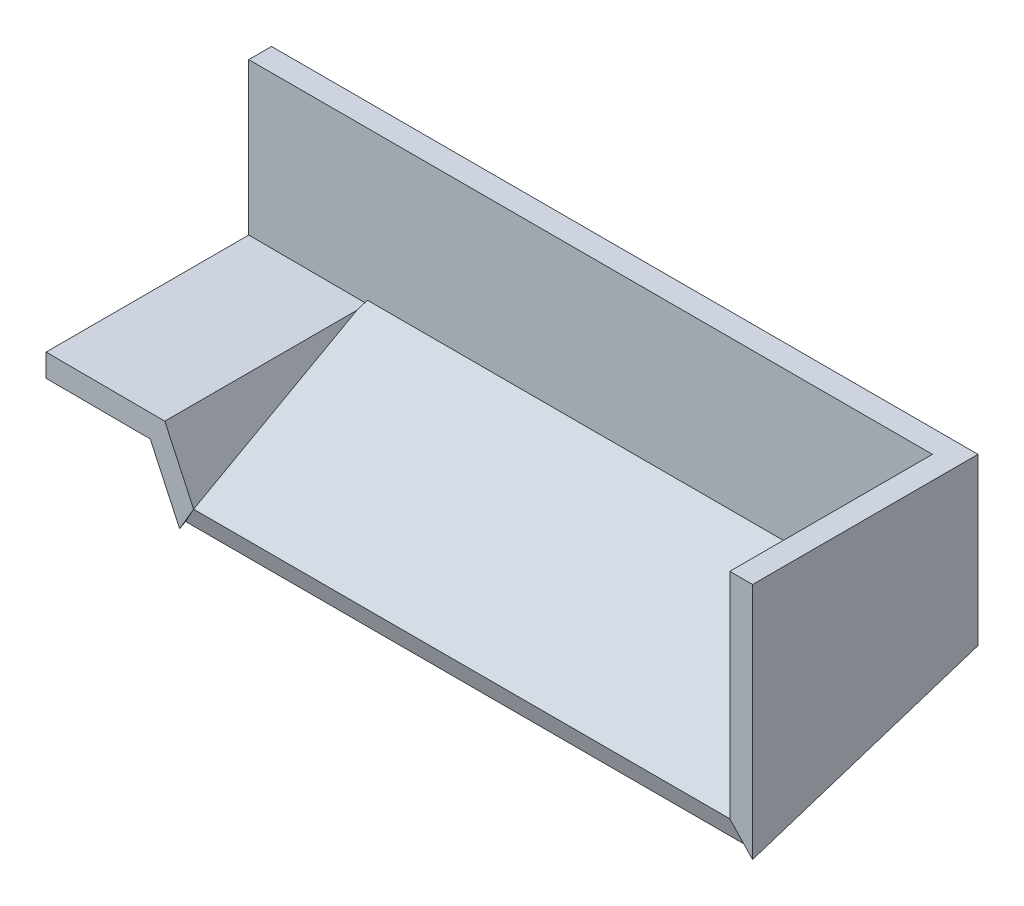
ISO-10303-21;
HEADER;
FILE_DESCRIPTION(('STEP AP214'),'2;1');
FILE_NAME('part.step','',(''),(''),'','','');
FILE_SCHEMA(('AUTOMOTIVE_DESIGN { 1 0 10303 214 1 1 1 1 }'));
ENDSEC;
DATA;
#1=APPLICATION_CONTEXT('core data for automotive mechanical design processes');
#2=APPLICATION_PROTOCOL_DEFINITION('international standard','automotive_design',2000,#1);
#3=PRODUCT_CONTEXT('',#1,'mechanical');
#4=PRODUCT('Part','Part','',(#3));
#5=PRODUCT_RELATED_PRODUCT_CATEGORY('part','',(#4));
#6=PRODUCT_DEFINITION_FORMATION('','',#4);
#7=PRODUCT_DEFINITION_CONTEXT('part definition',#1,'design');
#8=PRODUCT_DEFINITION('design','',#6,#7);
#9=PRODUCT_DEFINITION_SHAPE('','',#8);
#10=(LENGTH_UNIT() NAMED_UNIT(*) SI_UNIT(.MILLI.,.METRE.));
#11=(NAMED_UNIT(*) PLANE_ANGLE_UNIT() SI_UNIT($,.RADIAN.));
#12=(NAMED_UNIT(*) SI_UNIT($,.STERADIAN.) SOLID_ANGLE_UNIT());
#13=UNCERTAINTY_MEASURE_WITH_UNIT(LENGTH_MEASURE(1.E-05),#10,'distance_accuracy_value','');
#14=(GEOMETRIC_REPRESENTATION_CONTEXT(3) GLOBAL_UNCERTAINTY_ASSIGNED_CONTEXT((#13)) GLOBAL_UNIT_ASSIGNED_CONTEXT((#10,
#11,#12)) REPRESENTATION_CONTEXT('',''));
#15=CARTESIAN_POINT('',(0.,0.,0.));
#16=DIRECTION('',(0.,0.,1.));
#17=DIRECTION('',(1.,0.,0.));
#18=AXIS2_PLACEMENT_3D('',#15,#16,#17);
#19=CARTESIAN_POINT('',(65.9999999999999,200.410930223505,-2153.1741858194));
#20=DIRECTION('',(0.707106781186554,0.673097987092456,0.216654332456276));
#21=DIRECTION('',(0.156924969843194,0.149377553908836,-0.976248380397082));
#22=AXIS2_PLACEMENT_3D('',#19,#20,#21);
#23=PLANE('',#22);
#24=DIRECTION('',(0.689474113973616,-0.724310324488266,0.));
#25=VECTOR('',#24,1.);
#26=CARTESIAN_POINT('',(60.,174.043896,-2051.675));
#27=LINE('',#26,#25);
#28=CARTESIAN_POINT('',(60.,174.043896,-2051.675));
#29=VERTEX_POINT('',#28);
#30=CARTESIAN_POINT('',(65.9999999999999,167.740741379904,-2051.675));
#31=VERTEX_POINT('',#30);
#32=EDGE_CURVE('E14',#29,#31,#27,.T.);
#33=ORIENTED_EDGE('',*,*,#32,.F.);
#34=DIRECTION('',(0.707106781186541,-0.673097987092484,-0.216654332456233));
#35=VECTOR('',#34,1.);
#36=CARTESIAN_POINT('',(60.,174.043896,-2051.675));
#37=LINE('',#36,#35);
#38=CARTESIAN_POINT('',(65.9999999999999,168.332470187087,-2053.51337297184));
#39=VERTEX_POINT('',#38);
#40=EDGE_CURVE('E85',#29,#39,#37,.T.);
#41=ORIENTED_EDGE('',*,*,#40,.T.);
#42=DIRECTION('',(0.,-0.306395495306557,0.951904302152191));
#43=VECTOR('',#42,1.);
#44=CARTESIAN_POINT('',(65.9999999999999,200.410930223505,-2153.1741858194));
#45=LINE('',#44,#43);
#46=EDGE_CURVE('E261',#39,#31,#45,.T.);
#47=ORIENTED_EDGE('',*,*,#46,.T.);
#48=EDGE_LOOP('',(#33,#41,#47));
#49=FACE_BOUND('',#48,.T.);
#50=ADVANCED_FACE('F74',(#49),#23,.F.);
#51=CARTESIAN_POINT('',(-88.7498349655472,174.043896,-2051.675));
#52=DIRECTION('',(0.,0.306395495306557,-0.951904302152191));
#53=DIRECTION('',(1.,0.,0.));
#54=AXIS2_PLACEMENT_3D('',#51,#52,#53);
#55=PLANE('',#54);
#56=ORIENTED_EDGE('',*,*,#40,.F.);
#57=DIRECTION('',(1.,0.,0.));
#58=VECTOR('',#57,1.);
#59=CARTESIAN_POINT('',(-88.7498349655472,174.043896,-2051.675));
#60=LINE('',#59,#58);
#61=CARTESIAN_POINT('',(-81.1580015599324,174.043896,-2051.675));
#62=VERTEX_POINT('',#61);
#63=EDGE_CURVE('E207',#62,#29,#60,.T.);
#64=ORIENTED_EDGE('',*,*,#63,.F.);
#65=DIRECTION('',(-0.55055005957005,-0.794651759321001,-0.255779618647485));
#66=VECTOR('',#65,1.);
#67=CARTESIAN_POINT('',(-81.1580015599324,174.043896,-2051.675));
#68=LINE('',#67,#66);
#69=CARTESIAN_POINT('',(-85.1149874781617,168.332470187087,-2053.51337297184));
#70=VERTEX_POINT('',#69);
#71=EDGE_CURVE('E253',#62,#70,#68,.T.);
#72=ORIENTED_EDGE('',*,*,#71,.T.);
#73=DIRECTION('',(-1.,0.,0.));
#74=VECTOR('',#73,1.);
#75=CARTESIAN_POINT('',(-88.7498349655471,168.332470187087,-2053.51337297184));
#76=LINE('',#75,#74);
#77=EDGE_CURVE('E281',#70,#39,#76,.F.);
#78=ORIENTED_EDGE('',*,*,#77,.T.);
#79=EDGE_LOOP('',(#56,#64,#72,#78));
#80=FACE_BOUND('',#79,.T.);
#81=ADVANCED_FACE('F424',(#80),#55,.F.);
#82=CARTESIAN_POINT('',(8.68903530955106,-32.830905852799,-1428.54242522263));
#83=DIRECTION('',(0.828926894883838,-0.484095403635641,-0.280235335240015));
#84=DIRECTION('',(-0.241990858302143,0.141323273438157,-0.959931329253773));
#85=AXIS2_PLACEMENT_3D('',#82,#83,#84);
#86=PLANE('',#85);
#87=ORIENTED_EDGE('',*,*,#71,.F.);
#88=DIRECTION('',(-0.504302119206771,-0.86352728536136,0.));
#89=VECTOR('',#88,1.);
#90=CARTESIAN_POINT('',(-81.1580015599324,174.043896,-2051.675));
#91=LINE('',#90,#89);
#92=CARTESIAN_POINT('',(-84.8390598038214,167.740741379904,-2051.675));
#93=VERTEX_POINT('',#92);
#94=EDGE_CURVE('E248',#62,#93,#91,.T.);
#95=ORIENTED_EDGE('',*,*,#94,.T.);
#96=DIRECTION('',(0.141438259135338,-0.303315325540556,0.942334883226229));
#97=VECTOR('',#96,1.);
#98=CARTESIAN_POINT('',(8.68903530955106,-32.830905852799,-1428.54242522263));
#99=LINE('',#98,#97);
#100=EDGE_CURVE('E267',#70,#93,#99,.T.);
#101=ORIENTED_EDGE('',*,*,#100,.F.);
#102=EDGE_LOOP('',(#87,#95,#101));
#103=FACE_BOUND('',#102,.T.);
#104=ADVANCED_FACE('F428',(#103),#86,.T.);
#105=CARTESIAN_POINT('',(-88.7498349655472,190.324635277696,-2051.675));
#106=DIRECTION('',(0.,0.,-1.));
#107=DIRECTION('',(-0.999990687223878,0.00431572305834902,0.));
#108=AXIS2_PLACEMENT_3D('',#105,#106,#107);
#109=PLANE('',#108);
#110=DIRECTION('',(-0.999990687223878,0.00431572305834902,0.));
#111=VECTOR('',#110,1.);
#112=CARTESIAN_POINT('',(-88.7757293038973,184.324691154353,-2051.675));
#113=LINE('',#112,#111);
#114=CARTESIAN_POINT('',(-92.5799384560384,184.341109220408,-2051.675));
#115=VERTEX_POINT('',#114);
#116=CARTESIAN_POINT('',(-120.025894338734,184.45955946817,-2051.675));
#117=VERTEX_POINT('',#116);
#118=EDGE_CURVE('E289',#115,#117,#113,.T.);
#119=ORIENTED_EDGE('',*,*,#118,.F.);
#120=DIRECTION('',(-0.422618261740701,0.906307787036649,0.));
#121=VECTOR('',#120,1.);
#122=CARTESIAN_POINT('',(-5.4378467222199,-2.5357095704442,-2051.675));
#123=LINE('',#122,#121);
#124=EDGE_CURVE('E285',#93,#115,#123,.T.);
#125=ORIENTED_EDGE('',*,*,#124,.F.);
#126=ORIENTED_EDGE('',*,*,#94,.F.);
#127=DIRECTION('',(-0.422618261740701,0.906307787036649,0.));
#128=VECTOR('',#127,1.);
#129=CARTESIAN_POINT('',(0.,0.,-2051.675));
#130=LINE('',#129,#128);
#131=CARTESIAN_POINT('',(-88.7498349655472,190.324635277696,-2051.675));
#132=VERTEX_POINT('',#131);
#133=EDGE_CURVE('E188',#62,#132,#130,.T.);
#134=ORIENTED_EDGE('',*,*,#133,.T.);
#135=DIRECTION('',(-0.999990687223878,0.00431572305834902,0.));
#136=VECTOR('',#135,1.);
#137=CARTESIAN_POINT('',(-88.7498349655472,190.324635277696,-2051.675));
#138=LINE('',#137,#136);
#139=CARTESIAN_POINT('',(-120.000000000384,190.459503591513,-2051.675));
#140=VERTEX_POINT('',#139);
#141=EDGE_CURVE('E185',#132,#140,#138,.T.);
#142=ORIENTED_EDGE('',*,*,#141,.T.);
#143=DIRECTION('',(-0.00431572305834902,-0.999990687223878,0.));
#144=VECTOR('',#143,1.);
#145=CARTESIAN_POINT('',(-120.000000000384,190.459503591513,-2051.675));
#146=LINE('',#145,#144);
#147=EDGE_CURVE('E239',#140,#117,#146,.T.);
#148=ORIENTED_EDGE('',*,*,#147,.T.);
#149=EDGE_LOOP('',(#119,#125,#126,#134,#142,#148));
#150=FACE_BOUND('',#149,.T.);
#151=ADVANCED_FACE('F395',(#150),#109,.F.);
#152=CARTESIAN_POINT('',(-120.000000000384,190.459503591513,-2105.025));
#153=DIRECTION('',(-0.999990687223878,0.00431572305834902,0.));
#154=DIRECTION('',(0.,0.,1.));
#155=AXIS2_PLACEMENT_3D('',#152,#153,#154);
#156=PLANE('',#155);
#157=ORIENTED_EDGE('',*,*,#147,.F.);
#158=DIRECTION('',(0.,0.,1.));
#159=VECTOR('',#158,1.);
#160=CARTESIAN_POINT('',(-120.000000000384,190.459503591513,-2105.025));
#161=LINE('',#160,#159);
#162=CARTESIAN_POINT('',(-120.000000000384,190.459503591512,-2105.025));
#163=VERTEX_POINT('',#162);
#164=EDGE_CURVE('E197',#163,#140,#161,.T.);
#165=ORIENTED_EDGE('',*,*,#164,.F.);
#166=DIRECTION('',(-0.0030516770402824,-0.707100196059335,-0.707106781186612));
#167=VECTOR('',#166,1.);
#168=CARTESIAN_POINT('',(-120.000000000384,190.459503591512,-2105.025));
#169=LINE('',#168,#167);
#170=CARTESIAN_POINT('',(-120.025894338734,184.45955946817,-2111.025));
#171=VERTEX_POINT('',#170);
#172=EDGE_CURVE('E234',#163,#171,#169,.T.);
#173=ORIENTED_EDGE('',*,*,#172,.T.);
#174=DIRECTION('',(0.,0.,1.));
#175=VECTOR('',#174,1.);
#176=CARTESIAN_POINT('',(-120.025894338734,184.45955946817,-2105.025));
#177=LINE('',#176,#175);
#178=EDGE_CURVE('E294',#171,#117,#177,.T.);
#179=ORIENTED_EDGE('',*,*,#178,.T.);
#180=EDGE_LOOP('',(#157,#165,#173,#179));
#181=FACE_BOUND('',#180,.T.);
#182=ADVANCED_FACE('F393',(#181),#156,.T.);
#183=CARTESIAN_POINT('',(0.793833422292556,183.938130127213,-2111.025));
#184=DIRECTION('',(0.00305167704028202,0.707100196059465,-0.707106781186483));
#185=DIRECTION('',(-0.99999534362278,0.00215785148126406,-0.00215787157703857));
#186=AXIS2_PLACEMENT_3D('',#183,#184,#185);
#187=PLANE('',#186);
#188=ORIENTED_EDGE('',*,*,#172,.F.);
#189=DIRECTION('',(4.52577043816717E-11,-0.707110073757822,-0.707103488599942));
#190=VECTOR('',#189,1.);
#191=CARTESIAN_POINT('',(-120.000000000384,190.459503591512,-2105.025));
#192=LINE('',#191,#190);
#193=CARTESIAN_POINT('',(-120.,184.459447714334,-2111.025));
#194=VERTEX_POINT('',#193);
#195=EDGE_CURVE('E226',#163,#194,#192,.T.);
#196=ORIENTED_EDGE('',*,*,#195,.T.);
#197=DIRECTION('',(0.999990687223878,-0.00431572305834902,0.));
#198=VECTOR('',#197,1.);
#199=CARTESIAN_POINT('',(0.793833422292556,183.938130127213,-2111.025));
#200=LINE('',#199,#198);
#201=EDGE_CURVE('E272',#171,#194,#200,.T.);
#202=ORIENTED_EDGE('',*,*,#201,.F.);
#203=EDGE_LOOP('',(#188,#196,#202));
#204=FACE_BOUND('',#203,.T.);
#205=ADVANCED_FACE('F420',(#204),#187,.T.);
#206=CARTESIAN_POINT('',(-120.,230.45950359151,-2105.025));
#207=DIRECTION('',(1.,0.,0.));
#208=DIRECTION('',(0.,-1.,0.));
#209=AXIS2_PLACEMENT_3D('',#206,#207,#208);
#210=PLANE('',#209);
#211=ORIENTED_EDGE('',*,*,#195,.F.);
#212=DIRECTION('',(0.,-1.,0.));
#213=VECTOR('',#212,1.);
#214=CARTESIAN_POINT('',(-120.,230.45950359151,-2105.025));
#215=LINE('',#214,#213);
#216=CARTESIAN_POINT('',(-120.,230.45950359151,-2105.025));
#217=VERTEX_POINT('',#216);
#218=EDGE_CURVE('E153',#217,#163,#215,.T.);
#219=ORIENTED_EDGE('',*,*,#218,.F.);
#220=DIRECTION('',(0.,0.,-1.));
#221=VECTOR('',#220,1.);
#222=CARTESIAN_POINT('',(-120.,230.45950359151,-2105.025));
#223=LINE('',#222,#221);
#224=CARTESIAN_POINT('',(-120.,230.45950359151,-2111.025));
#225=VERTEX_POINT('',#224);
#226=EDGE_CURVE('E223',#217,#225,#223,.T.);
#227=ORIENTED_EDGE('',*,*,#226,.T.);
#228=DIRECTION('',(0.,-1.,0.));
#229=VECTOR('',#228,1.);
#230=CARTESIAN_POINT('',(-120.,0.,-2111.025));
#231=LINE('',#230,#229);
#232=EDGE_CURVE('E228',#225,#194,#231,.T.);
#233=ORIENTED_EDGE('',*,*,#232,.T.);
#234=EDGE_LOOP('',(#211,#219,#227,#233));
#235=FACE_BOUND('',#234,.T.);
#236=ADVANCED_FACE('F220',(#235),#210,.F.);
#237=CARTESIAN_POINT('',(59.9999999999999,230.45950359151,-2105.025));
#238=DIRECTION('',(0.,-1.,0.));
#239=DIRECTION('',(0.,0.,1.));
#240=AXIS2_PLACEMENT_3D('',#237,#238,#239);
#241=PLANE('',#240);
#242=DIRECTION('',(0.,0.,1.));
#243=VECTOR('',#242,1.);
#244=CARTESIAN_POINT('',(65.9999999999999,230.45950359151,-2105.025));
#245=LINE('',#244,#243);
#246=CARTESIAN_POINT('',(65.9999999999999,230.45950359151,-2111.025));
#247=VERTEX_POINT('',#246);
#248=CARTESIAN_POINT('',(65.9999999999999,230.45950359151,-2051.675));
#249=VERTEX_POINT('',#248);
#250=EDGE_CURVE('E298',#247,#249,#245,.T.);
#251=ORIENTED_EDGE('',*,*,#250,.F.);
#252=DIRECTION('',(1.,0.,0.));
#253=VECTOR('',#252,1.);
#254=CARTESIAN_POINT('',(0.,230.45950359151,-2111.025));
#255=LINE('',#254,#253);
#256=EDGE_CURVE('E299',#247,#225,#255,.F.);
#257=ORIENTED_EDGE('',*,*,#256,.T.);
#258=ORIENTED_EDGE('',*,*,#226,.F.);
#259=DIRECTION('',(-1.,0.,0.));
#260=VECTOR('',#259,1.);
#261=CARTESIAN_POINT('',(79.9999999999999,230.45950359151,-2105.025));
#262=LINE('',#261,#260);
#263=CARTESIAN_POINT('',(59.9999999999999,230.45950359151,-2105.025));
#264=VERTEX_POINT('',#263);
#265=EDGE_CURVE('E195',#264,#217,#262,.T.);
#266=ORIENTED_EDGE('',*,*,#265,.F.);
#267=DIRECTION('',(0.,0.,1.));
#268=VECTOR('',#267,1.);
#269=CARTESIAN_POINT('',(59.9999999999999,230.45950359151,-2105.025));
#270=LINE('',#269,#268);
#271=CARTESIAN_POINT('',(59.9999999999999,230.45950359151,-2051.675));
#272=VERTEX_POINT('',#271);
#273=EDGE_CURVE('E200',#264,#272,#270,.T.);
#274=ORIENTED_EDGE('',*,*,#273,.T.);
#275=DIRECTION('',(1.,0.,0.));
#276=VECTOR('',#275,1.);
#277=CARTESIAN_POINT('',(59.9999999999999,230.45950359151,-2051.675));
#278=LINE('',#277,#276);
#279=EDGE_CURVE('E241',#272,#249,#278,.T.);
#280=ORIENTED_EDGE('',*,*,#279,.T.);
#281=EDGE_LOOP('',(#251,#257,#258,#266,#274,#280));
#282=FACE_BOUND('',#281,.T.);
#283=ADVANCED_FACE('F412',(#282),#241,.F.);
#284=CARTESIAN_POINT('',(59.9999999999999,350.,-2051.675));
#285=DIRECTION('',(0.,0.,-1.));
#286=DIRECTION('',(0.,-1.,0.));
#287=AXIS2_PLACEMENT_3D('',#284,#285,#286);
#288=PLANE('',#287);
#289=DIRECTION('',(0.,-1.,0.));
#290=VECTOR('',#289,1.);
#291=CARTESIAN_POINT('',(59.9999999999999,350.,-2051.675));
#292=LINE('',#291,#290);
#293=EDGE_CURVE('E203',#272,#29,#292,.T.);
#294=ORIENTED_EDGE('',*,*,#293,.T.);
#295=ORIENTED_EDGE('',*,*,#32,.T.);
#296=DIRECTION('',(0.,-1.,0.));
#297=VECTOR('',#296,1.);
#298=CARTESIAN_POINT('',(65.9999999999999,350.,-2051.675));
#299=LINE('',#298,#297);
#300=EDGE_CURVE('E278',#249,#31,#299,.T.);
#301=ORIENTED_EDGE('',*,*,#300,.F.);
#302=ORIENTED_EDGE('',*,*,#279,.F.);
#303=EDGE_LOOP('',(#294,#295,#301,#302));
#304=FACE_BOUND('',#303,.T.);
#305=ADVANCED_FACE('F76',(#304),#288,.F.);
#306=CARTESIAN_POINT('',(65.9999999999999,350.,-2105.025));
#307=DIRECTION('',(-1.,0.,0.));
#308=DIRECTION('',(0.,-1.,0.));
#309=AXIS2_PLACEMENT_3D('',#306,#307,#308);
#310=PLANE('',#309);
#311=DIRECTION('',(0.,1.,0.));
#312=VECTOR('',#311,1.);
#313=CARTESIAN_POINT('',(66.,0.,-2111.025));
#314=LINE('',#313,#312);
#315=CARTESIAN_POINT('',(65.9999999999999,186.844103561722,-2111.025));
#316=VERTEX_POINT('',#315);
#317=EDGE_CURVE('E324',#316,#247,#314,.T.);
#318=ORIENTED_EDGE('',*,*,#317,.T.);
#319=ORIENTED_EDGE('',*,*,#250,.T.);
#320=ORIENTED_EDGE('',*,*,#300,.T.);
#321=ORIENTED_EDGE('',*,*,#46,.F.);
#322=DIRECTION('',(0.,-0.306395495306557,0.951904302152191));
#323=VECTOR('',#322,1.);
#324=CARTESIAN_POINT('',(65.9999999999999,200.410930223505,-2153.1741858194));
#325=LINE('',#324,#323);
#326=EDGE_CURVE('E293',#316,#39,#325,.T.);
#327=ORIENTED_EDGE('',*,*,#326,.F.);
#328=EDGE_LOOP('',(#318,#319,#320,#321,#327));
#329=FACE_BOUND('',#328,.T.);
#330=ADVANCED_FACE('F348',(#329),#310,.F.);
#331=CARTESIAN_POINT('',(-88.7498349655471,-37.0964018600904,-1415.29045493472));
#332=DIRECTION('',(0.,-0.951904302152191,-0.306395495306557));
#333=DIRECTION('',(0.,-0.306395495306557,0.951904302152191));
#334=AXIS2_PLACEMENT_3D('',#331,#332,#333);
#335=PLANE('',#334);
#336=ORIENTED_EDGE('',*,*,#77,.F.);
#337=DIRECTION('',(0.141438259135338,-0.303315325540556,0.942334883226229));
#338=VECTOR('',#337,1.);
#339=CARTESIAN_POINT('',(8.68903530955106,-32.830905852799,-1428.54242522263));
#340=LINE('',#339,#338);
#341=CARTESIAN_POINT('',(-92.5799384560383,184.341109220408,-2103.24873984521));
#342=VERTEX_POINT('',#341);
#343=EDGE_CURVE('E328',#342,#70,#340,.T.);
#344=ORIENTED_EDGE('',*,*,#343,.F.);
#345=DIRECTION('',(-0.999900812747782,0.00431533518138797,-0.0134068097844652));
#346=VECTOR('',#345,1.);
#347=CARTESIAN_POINT('',(-88.8002247021252,184.324796870693,-2103.19806091517));
#348=LINE('',#347,#346);
#349=CARTESIAN_POINT('',(-82.7498349655471,184.298684821019,-2103.11693644433));
#350=VERTEX_POINT('',#349);
#351=EDGE_CURVE('E277',#350,#342,#348,.T.);
#352=ORIENTED_EDGE('',*,*,#351,.F.);
#353=DIRECTION('',(0.,-0.306395495306557,0.951904302152191));
#354=VECTOR('',#353,1.);
#355=CARTESIAN_POINT('',(-82.7498349655471,-37.0964018600904,-1415.29045493472));
#356=LINE('',#355,#354);
#357=CARTESIAN_POINT('',(-82.7498349655471,186.844103561722,-2111.025));
#358=VERTEX_POINT('',#357);
#359=EDGE_CURVE('E332',#358,#350,#356,.T.);
#360=ORIENTED_EDGE('',*,*,#359,.F.);
#361=DIRECTION('',(1.,0.,0.));
#362=VECTOR('',#361,1.);
#363=CARTESIAN_POINT('',(-88.7498349655472,186.844103561722,-2111.025));
#364=LINE('',#363,#362);
#365=EDGE_CURVE('E320',#358,#316,#364,.T.);
#366=ORIENTED_EDGE('',*,*,#365,.T.);
#367=ORIENTED_EDGE('',*,*,#326,.T.);
#368=EDGE_LOOP('',(#336,#344,#352,#360,#366,#367));
#369=FACE_BOUND('',#368,.T.);
#370=ADVANCED_FACE('F360',(#369),#335,.T.);
#371=CARTESIAN_POINT('',(-5.4378467222199,-2.5357095704442,-2105.025));
#372=DIRECTION('',(0.906307787036649,0.422618261740701,0.));
#373=DIRECTION('',(-0.422618261740701,0.906307787036649,0.));
#374=AXIS2_PLACEMENT_3D('',#371,#372,#373);
#375=PLANE('',#374);
#376=ORIENTED_EDGE('',*,*,#343,.T.);
#377=ORIENTED_EDGE('',*,*,#100,.T.);
#378=ORIENTED_EDGE('',*,*,#124,.T.);
#379=DIRECTION('',(0.,0.,1.));
#380=VECTOR('',#379,1.);
#381=CARTESIAN_POINT('',(-92.5799384560384,184.341109220408,-2105.025));
#382=LINE('',#381,#380);
#383=EDGE_CURVE('E319',#342,#115,#382,.T.);
#384=ORIENTED_EDGE('',*,*,#383,.F.);
#385=EDGE_LOOP('',(#376,#377,#378,#384));
#386=FACE_BOUND('',#385,.T.);
#387=ADVANCED_FACE('F389',(#386),#375,.F.);
#388=CARTESIAN_POINT('',(-88.7757293038973,184.324691154353,-2105.025));
#389=DIRECTION('',(0.00431572305834902,0.999990687223878,0.));
#390=DIRECTION('',(-0.999990687223878,0.00431572305834902,0.));
#391=AXIS2_PLACEMENT_3D('',#388,#389,#390);
#392=PLANE('',#391);
#393=ORIENTED_EDGE('',*,*,#178,.F.);
#394=ORIENTED_EDGE('',*,*,#201,.T.);
#395=DIRECTION('',(0.999990687223878,-0.00431572305834902,0.));
#396=VECTOR('',#395,1.);
#397=CARTESIAN_POINT('',(0.793833422292556,183.938130127213,-2111.025));
#398=LINE('',#397,#396);
#399=CARTESIAN_POINT('',(-82.7498349655471,184.298684821019,-2111.025));
#400=VERTEX_POINT('',#399);
#401=EDGE_CURVE('E314',#194,#400,#398,.T.);
#402=ORIENTED_EDGE('',*,*,#401,.T.);
#403=DIRECTION('',(0.,0.,1.));
#404=VECTOR('',#403,1.);
#405=CARTESIAN_POINT('',(-82.7498349655471,184.298684821019,0.));
#406=LINE('',#405,#404);
#407=EDGE_CURVE('E315',#400,#350,#406,.T.);
#408=ORIENTED_EDGE('',*,*,#407,.T.);
#409=ORIENTED_EDGE('',*,*,#351,.T.);
#410=ORIENTED_EDGE('',*,*,#383,.T.);
#411=ORIENTED_EDGE('',*,*,#118,.T.);
#412=EDGE_LOOP('',(#393,#394,#402,#408,#409,#410,#411));
#413=FACE_BOUND('',#412,.T.);
#414=ADVANCED_FACE('F374',(#413),#392,.F.);
#415=CARTESIAN_POINT('',(0.,0.,-2111.025));
#416=DIRECTION('',(0.,0.,-1.));
#417=DIRECTION('',(1.,0.,0.));
#418=AXIS2_PLACEMENT_3D('',#415,#416,#417);
#419=PLANE('',#418);
#420=ORIENTED_EDGE('',*,*,#256,.F.);
#421=ORIENTED_EDGE('',*,*,#317,.F.);
#422=ORIENTED_EDGE('',*,*,#365,.F.);
#423=DIRECTION('',(0.,-1.,0.));
#424=VECTOR('',#423,1.);
#425=CARTESIAN_POINT('',(-82.7498349655471,0.,-2111.025));
#426=LINE('',#425,#424);
#427=EDGE_CURVE('E310',#358,#400,#426,.T.);
#428=ORIENTED_EDGE('',*,*,#427,.T.);
#429=ORIENTED_EDGE('',*,*,#401,.F.);
#430=ORIENTED_EDGE('',*,*,#232,.F.);
#431=EDGE_LOOP('',(#420,#421,#422,#428,#429,#430));
#432=FACE_BOUND('',#431,.T.);
#433=ADVANCED_FACE('F354',(#432),#419,.T.);
#434=CARTESIAN_POINT('',(-82.7498349655471,0.,0.));
#435=DIRECTION('',(1.,0.,0.));
#436=DIRECTION('',(0.,0.,-1.));
#437=AXIS2_PLACEMENT_3D('',#434,#435,#436);
#438=PLANE('',#437);
#439=ORIENTED_EDGE('',*,*,#359,.T.);
#440=ORIENTED_EDGE('',*,*,#407,.F.);
#441=ORIENTED_EDGE('',*,*,#427,.F.);
#442=EDGE_LOOP('',(#439,#440,#441));
#443=FACE_BOUND('',#442,.T.);
#444=ADVANCED_FACE('F369',(#443),#438,.T.);
#445=CARTESIAN_POINT('',(59.9999999999999,350.,-2105.025));
#446=DIRECTION('',(-1.,0.,0.));
#447=DIRECTION('',(0.,-1.,0.));
#448=AXIS2_PLACEMENT_3D('',#445,#446,#447);
#449=PLANE('',#448);
#450=DIRECTION('',(0.,1.,0.));
#451=VECTOR('',#450,1.);
#452=CARTESIAN_POINT('',(59.9999999999999,350.,-2105.025));
#453=LINE('',#452,#451);
#454=CARTESIAN_POINT('',(60.,191.216,-2105.025));
#455=VERTEX_POINT('',#454);
#456=EDGE_CURVE('E158',#455,#264,#453,.T.);
#457=ORIENTED_EDGE('',*,*,#456,.F.);
#458=DIRECTION('',(0.,-0.306395495306558,0.951904302152191));
#459=VECTOR('',#458,1.);
#460=CARTESIAN_POINT('',(60.,-31.3849760471773,-1413.45208196288));
#461=LINE('',#460,#459);
#462=EDGE_CURVE('E180',#455,#29,#461,.T.);
#463=ORIENTED_EDGE('',*,*,#462,.T.);
#464=ORIENTED_EDGE('',*,*,#293,.F.);
#465=ORIENTED_EDGE('',*,*,#273,.F.);
#466=EDGE_LOOP('',(#457,#463,#464,#465));
#467=FACE_BOUND('',#466,.T.);
#468=ADVANCED_FACE('F411',(#467),#449,.T.);
#469=CARTESIAN_POINT('',(-88.7498349655471,-31.3849760471773,-1413.45208196288));
#470=DIRECTION('',(0.,-0.951904302152191,-0.306395495306557));
#471=DIRECTION('',(0.,-0.306395495306557,0.951904302152191));
#472=AXIS2_PLACEMENT_3D('',#469,#470,#471);
#473=PLANE('',#472);
#474=ORIENTED_EDGE('',*,*,#63,.T.);
#475=ORIENTED_EDGE('',*,*,#462,.F.);
#476=DIRECTION('',(1.,0.,0.));
#477=VECTOR('',#476,1.);
#478=CARTESIAN_POINT('',(-88.7498349655472,191.216,-2105.025));
#479=LINE('',#478,#477);
#480=CARTESIAN_POINT('',(-88.7498349655472,191.216,-2105.025));
#481=VERTEX_POINT('',#480);
#482=EDGE_CURVE('E165',#481,#455,#479,.T.);
#483=ORIENTED_EDGE('',*,*,#482,.F.);
#484=DIRECTION('',(0.,-0.306395495306558,0.951904302152191));
#485=VECTOR('',#484,1.);
#486=CARTESIAN_POINT('',(-88.7498349655471,-31.3849760471773,-1413.45208196288));
#487=LINE('',#486,#485);
#488=CARTESIAN_POINT('',(-88.7498349655472,190.324635277696,-2102.25572327451));
#489=VERTEX_POINT('',#488);
#490=EDGE_CURVE('E142',#481,#489,#487,.T.);
#491=ORIENTED_EDGE('',*,*,#490,.T.);
#492=DIRECTION('',(0.141438259135338,-0.303315325540556,0.942334883226229));
#493=VECTOR('',#492,1.);
#494=CARTESIAN_POINT('',(-79.1785078624466,169.798858066637,-2038.48658850745));
#495=LINE('',#494,#493);
#496=EDGE_CURVE('E169',#489,#62,#495,.T.);
#497=ORIENTED_EDGE('',*,*,#496,.T.);
#498=EDGE_LOOP('',(#474,#475,#483,#491,#497));
#499=FACE_BOUND('',#498,.T.);
#500=ADVANCED_FACE('F406',(#499),#473,.F.);
#501=CARTESIAN_POINT('',(0.,0.,-2105.025));
#502=DIRECTION('',(0.906307787036649,0.422618261740701,0.));
#503=DIRECTION('',(-0.422618261740701,0.906307787036649,0.));
#504=AXIS2_PLACEMENT_3D('',#501,#502,#503);
#505=PLANE('',#504);
#506=ORIENTED_EDGE('',*,*,#496,.F.);
#507=DIRECTION('',(0.,0.,1.));
#508=VECTOR('',#507,1.);
#509=CARTESIAN_POINT('',(-88.7498349655472,190.324635277696,-2105.025));
#510=LINE('',#509,#508);
#511=EDGE_CURVE('E162',#489,#132,#510,.T.);
#512=ORIENTED_EDGE('',*,*,#511,.T.);
#513=ORIENTED_EDGE('',*,*,#133,.F.);
#514=EDGE_LOOP('',(#506,#512,#513));
#515=FACE_BOUND('',#514,.T.);
#516=ADVANCED_FACE('F535',(#515),#505,.T.);
#517=CARTESIAN_POINT('',(-88.7498349655472,190.324635277696,-2105.025));
#518=DIRECTION('',(0.00431572305834902,0.999990687223878,0.));
#519=DIRECTION('',(-0.999990687223878,0.00431572305834902,0.));
#520=AXIS2_PLACEMENT_3D('',#517,#518,#519);
#521=PLANE('',#520);
#522=ORIENTED_EDGE('',*,*,#164,.T.);
#523=ORIENTED_EDGE('',*,*,#141,.F.);
#524=ORIENTED_EDGE('',*,*,#511,.F.);
#525=CARTESIAN_POINT('',(-88.7498349655472,190.324635277696,-2105.025));
#526=VERTEX_POINT('',#525);
#527=EDGE_CURVE('E139',#526,#489,#510,.T.);
#528=ORIENTED_EDGE('',*,*,#527,.F.);
#529=DIRECTION('',(0.999990687223878,-0.00431572305834902,0.));
#530=VECTOR('',#529,1.);
#531=CARTESIAN_POINT('',(-88.7498349655472,190.324635277696,-2105.025));
#532=LINE('',#531,#530);
#533=EDGE_CURVE('E146',#163,#526,#532,.T.);
#534=ORIENTED_EDGE('',*,*,#533,.F.);
#535=EDGE_LOOP('',(#522,#523,#524,#528,#534));
#536=FACE_BOUND('',#535,.T.);
#537=ADVANCED_FACE('F160',(#536),#521,.T.);
#538=CARTESIAN_POINT('',(0.,0.,-2105.025));
#539=DIRECTION('',(0.,0.,-1.));
#540=DIRECTION('',(1.,0.,0.));
#541=AXIS2_PLACEMENT_3D('',#538,#539,#540);
#542=PLANE('',#541);
#543=ORIENTED_EDGE('',*,*,#265,.T.);
#544=ORIENTED_EDGE('',*,*,#218,.T.);
#545=ORIENTED_EDGE('',*,*,#533,.T.);
#546=DIRECTION('',(0.,-1.,0.));
#547=VECTOR('',#546,1.);
#548=CARTESIAN_POINT('',(-88.7498349655471,0.,-2105.025));
#549=LINE('',#548,#547);
#550=EDGE_CURVE('E135',#481,#526,#549,.T.);
#551=ORIENTED_EDGE('',*,*,#550,.F.);
#552=ORIENTED_EDGE('',*,*,#482,.T.);
#553=ORIENTED_EDGE('',*,*,#456,.T.);
#554=EDGE_LOOP('',(#543,#544,#545,#551,#552,#553));
#555=FACE_BOUND('',#554,.T.);
#556=ADVANCED_FACE('F151',(#555),#542,.F.);
#557=CARTESIAN_POINT('',(-88.7498349655471,0.,0.));
#558=DIRECTION('',(1.,0.,0.));
#559=DIRECTION('',(0.,0.,-1.));
#560=AXIS2_PLACEMENT_3D('',#557,#558,#559);
#561=PLANE('',#560);
#562=ORIENTED_EDGE('',*,*,#490,.F.);
#563=ORIENTED_EDGE('',*,*,#550,.T.);
#564=ORIENTED_EDGE('',*,*,#527,.T.);
#565=EDGE_LOOP('',(#562,#563,#564));
#566=FACE_BOUND('',#565,.T.);
#567=ADVANCED_FACE('F137',(#566),#561,.F.);
#568=CLOSED_SHELL('',(#50,#81,#104,#151,#182,#205,#236,#283,#305,#330,#370,#387,#414,#433,#444,
#468,#500,#516,#537,#556,#567));
#569=MANIFOLD_SOLID_BREP('B2',#568);
#570=ADVANCED_BREP_SHAPE_REPRESENTATION('',(#18,#569),#14);
#571=SHAPE_DEFINITION_REPRESENTATION(#9,#570);
ENDSEC;
END-ISO-10303-21;
